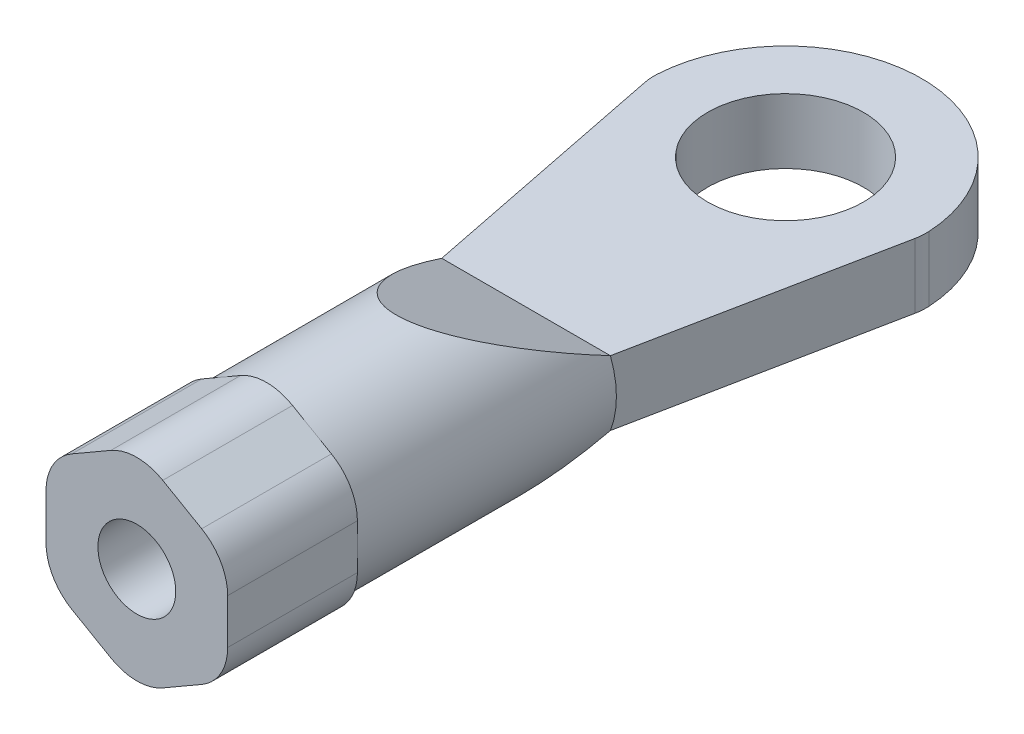
ISO-10303-21;
HEADER;
FILE_DESCRIPTION(('STEP AP214'),'2;1');
FILE_NAME('part.step','',(''),(''),'','','');
FILE_SCHEMA(('AUTOMOTIVE_DESIGN { 1 0 10303 214 1 1 1 1 }'));
ENDSEC;
DATA;
#1=APPLICATION_CONTEXT('core data for automotive mechanical design processes');
#2=APPLICATION_PROTOCOL_DEFINITION('international standard','automotive_design',2000,#1);
#3=PRODUCT_CONTEXT('',#1,'mechanical');
#4=PRODUCT('Part','Part','',(#3));
#5=PRODUCT_RELATED_PRODUCT_CATEGORY('part','',(#4));
#6=PRODUCT_DEFINITION_FORMATION('','',#4);
#7=PRODUCT_DEFINITION_CONTEXT('part definition',#1,'design');
#8=PRODUCT_DEFINITION('design','',#6,#7);
#9=PRODUCT_DEFINITION_SHAPE('','',#8);
#10=(LENGTH_UNIT() NAMED_UNIT(*) SI_UNIT(.MILLI.,.METRE.));
#11=(NAMED_UNIT(*) PLANE_ANGLE_UNIT() SI_UNIT($,.RADIAN.));
#12=(NAMED_UNIT(*) SI_UNIT($,.STERADIAN.) SOLID_ANGLE_UNIT());
#13=UNCERTAINTY_MEASURE_WITH_UNIT(LENGTH_MEASURE(1.E-05),#10,'distance_accuracy_value','');
#14=(GEOMETRIC_REPRESENTATION_CONTEXT(3) GLOBAL_UNCERTAINTY_ASSIGNED_CONTEXT((#13)) GLOBAL_UNIT_ASSIGNED_CONTEXT((#10,
#11,#12)) REPRESENTATION_CONTEXT('',''));
#15=CARTESIAN_POINT('',(0.,0.,0.));
#16=DIRECTION('',(0.,0.,1.));
#17=DIRECTION('',(1.,0.,0.));
#18=AXIS2_PLACEMENT_3D('',#15,#16,#17);
#19=CARTESIAN_POINT('',(0.,1.25,25.));
#20=DIRECTION('',(0.,0.,-1.));
#21=DIRECTION('',(-1.,0.,0.));
#22=AXIS2_PLACEMENT_3D('',#19,#20,#21);
#23=CYLINDRICAL_SURFACE('',#22,3.48209706929603);
#24=CARTESIAN_POINT('',(0.,1.25,7.19994256254673));
#25=DIRECTION('',(0.,0.91314099515027,-0.407643867825795));
#26=DIRECTION('',(0.,-0.407643867825795,-0.91314099515027));
#27=AXIS2_PLACEMENT_3D('',#24,#25,#26);
#28=ELLIPSE('',#27,8.54200772813805,3.48209706929603);
#29=CARTESIAN_POINT('',(-3.25,2.5,10.));
#30=VERTEX_POINT('',#29);
#31=CARTESIAN_POINT('',(3.25,2.5,10.));
#32=VERTEX_POINT('',#31);
#33=EDGE_CURVE('E194',#30,#32,#28,.T.);
#34=ORIENTED_EDGE('',*,*,#33,.F.);
#35=CARTESIAN_POINT('',(0.,1.25,10.));
#36=DIRECTION('',(0.,0.,1.));
#37=DIRECTION('',(1.,0.,0.));
#38=AXIS2_PLACEMENT_3D('',#35,#36,#37);
#39=CIRCLE('',#38,3.48209706929603);
#40=CARTESIAN_POINT('',(-3.25,0.,10.));
#41=VERTEX_POINT('',#40);
#42=EDGE_CURVE('E193',#30,#41,#39,.T.);
#43=ORIENTED_EDGE('',*,*,#42,.T.);
#44=CARTESIAN_POINT('',(0.,1.25,7.19994256254673));
#45=DIRECTION('',(0.,-0.91314099515027,-0.407643867825795));
#46=DIRECTION('',(0.,0.407643867825795,-0.91314099515027));
#47=AXIS2_PLACEMENT_3D('',#44,#45,#46);
#48=ELLIPSE('',#47,8.54200772813805,3.48209706929603);
#49=CARTESIAN_POINT('',(3.25,0.,10.));
#50=VERTEX_POINT('',#49);
#51=EDGE_CURVE('E177',#50,#41,#48,.T.);
#52=ORIENTED_EDGE('',*,*,#51,.F.);
#53=EDGE_CURVE('E191',#50,#32,#39,.T.);
#54=ORIENTED_EDGE('',*,*,#53,.T.);
#55=EDGE_LOOP('',(#34,#43,#52,#54));
#56=FACE_BOUND('',#55,.T.);
#57=CARTESIAN_POINT('',(0.,1.25,20.));
#58=DIRECTION('',(0.,0.,1.));
#59=DIRECTION('',(1.,0.,0.));
#60=AXIS2_PLACEMENT_3D('',#57,#58,#59);
#61=CIRCLE('',#60,3.48209706929603);
#62=CARTESIAN_POINT('',(3.48209706929603,1.25,20.));
#63=VERTEX_POINT('',#62);
#64=EDGE_CURVE('E257',#63,#63,#61,.T.);
#65=ORIENTED_EDGE('',*,*,#64,.F.);
#66=EDGE_LOOP('',(#65));
#67=FACE_BOUND('',#66,.T.);
#68=ADVANCED_FACE('F48',(#56,#67),#23,.T.);
#69=CARTESIAN_POINT('',(5.04807692307692,2.5,1.00961538461538));
#70=DIRECTION('',(0.98058067569092,0.,0.196116135138184));
#71=DIRECTION('',(0.196116135138184,0.,-0.98058067569092));
#72=AXIS2_PLACEMENT_3D('',#69,#70,#71);
#73=PLANE('',#72);
#74=DIRECTION('',(-0.196116135138184,0.,0.98058067569092));
#75=VECTOR('',#74,1.);
#76=CARTESIAN_POINT('',(5.04807692307692,0.,1.00961538461538));
#77=LINE('',#76,#75);
#78=CARTESIAN_POINT('',(5.20646912657525,0.,0.217654367123726));
#79=VERTEX_POINT('',#78);
#80=EDGE_CURVE('E182',#79,#50,#77,.T.);
#81=ORIENTED_EDGE('',*,*,#80,.F.);
#82=DIRECTION('',(0.,1.,0.));
#83=VECTOR('',#82,1.);
#84=CARTESIAN_POINT('',(5.20646912657525,2.5,0.217654367123726));
#85=LINE('',#84,#83);
#86=CARTESIAN_POINT('',(5.20646912657525,2.5,0.217654367123726));
#87=VERTEX_POINT('',#86);
#88=EDGE_CURVE('E255',#79,#87,#85,.T.);
#89=ORIENTED_EDGE('',*,*,#88,.T.);
#90=DIRECTION('',(-0.196116135138184,0.,0.98058067569092));
#91=VECTOR('',#90,1.);
#92=CARTESIAN_POINT('',(5.04807692307692,2.5,1.00961538461538));
#93=LINE('',#92,#91);
#94=EDGE_CURVE('E211',#87,#32,#93,.T.);
#95=ORIENTED_EDGE('',*,*,#94,.T.);
#96=DIRECTION('',(0.,-1.,0.));
#97=VECTOR('',#96,1.);
#98=CARTESIAN_POINT('',(3.25,2.5,10.));
#99=LINE('',#98,#97);
#100=EDGE_CURVE('E208',#32,#50,#99,.T.);
#101=ORIENTED_EDGE('',*,*,#100,.T.);
#102=EDGE_LOOP('',(#81,#89,#95,#101));
#103=FACE_BOUND('',#102,.T.);
#104=ADVANCED_FACE('F209',(#103),#73,.T.);
#105=CARTESIAN_POINT('',(0.,2.5,0.));
#106=DIRECTION('',(0.,-1.,0.));
#107=DIRECTION('',(0.,0.,-1.));
#108=AXIS2_PLACEMENT_3D('',#105,#106,#107);
#109=CYLINDRICAL_SURFACE('',#108,5.25);
#110=CARTESIAN_POINT('',(0.,0.,0.));
#111=DIRECTION('',(0.,1.,0.));
#112=DIRECTION('',(0.,0.,1.));
#113=AXIS2_PLACEMENT_3D('',#110,#111,#112);
#114=CIRCLE('',#113,5.25);
#115=CARTESIAN_POINT('',(5.24242025223552,0.,-0.282010458938883));
#116=VERTEX_POINT('',#115);
#117=CARTESIAN_POINT('',(-5.24242025223552,0.,-0.282010458938881));
#118=VERTEX_POINT('',#117);
#119=EDGE_CURVE('E204',#116,#118,#114,.T.);
#120=ORIENTED_EDGE('',*,*,#119,.T.);
#121=DIRECTION('',(0.,-1.,0.));
#122=VECTOR('',#121,1.);
#123=CARTESIAN_POINT('',(-5.24242025223552,2.5,-0.282010458938881));
#124=LINE('',#123,#122);
#125=CARTESIAN_POINT('',(-5.24242025223552,2.5,-0.282010458938881));
#126=VERTEX_POINT('',#125);
#127=EDGE_CURVE('E249',#118,#126,#124,.F.);
#128=ORIENTED_EDGE('',*,*,#127,.T.);
#129=CARTESIAN_POINT('',(0.,2.5,0.));
#130=DIRECTION('',(0.,1.,0.));
#131=DIRECTION('',(0.,0.,1.));
#132=AXIS2_PLACEMENT_3D('',#129,#130,#131);
#133=CIRCLE('',#132,5.25);
#134=CARTESIAN_POINT('',(5.24242025223552,2.5,-0.282010458938883));
#135=VERTEX_POINT('',#134);
#136=EDGE_CURVE('E230',#135,#126,#133,.T.);
#137=ORIENTED_EDGE('',*,*,#136,.F.);
#138=DIRECTION('',(0.,-1.,0.));
#139=VECTOR('',#138,1.);
#140=CARTESIAN_POINT('',(5.24242025223552,2.5,-0.282010458938883));
#141=LINE('',#140,#139);
#142=EDGE_CURVE('E246',#135,#116,#141,.T.);
#143=ORIENTED_EDGE('',*,*,#142,.T.);
#144=EDGE_LOOP('',(#120,#128,#137,#143));
#145=FACE_BOUND('',#144,.T.);
#146=ADVANCED_FACE('F404',(#145),#109,.T.);
#147=CARTESIAN_POINT('',(-5.04807692307692,2.5,1.00961538461539));
#148=DIRECTION('',(0.98058067569092,0.,-0.196116135138184));
#149=DIRECTION('',(-0.196116135138184,0.,-0.98058067569092));
#150=AXIS2_PLACEMENT_3D('',#147,#148,#149);
#151=PLANE('',#150);
#152=DIRECTION('',(0.196116135138184,0.,0.98058067569092));
#153=VECTOR('',#152,1.);
#154=CARTESIAN_POINT('',(-5.04807692307692,2.5,1.00961538461539));
#155=LINE('',#154,#153);
#156=CARTESIAN_POINT('',(-5.20646912657525,2.5,0.217654367123727));
#157=VERTEX_POINT('',#156);
#158=EDGE_CURVE('E233',#157,#30,#155,.T.);
#159=ORIENTED_EDGE('',*,*,#158,.F.);
#160=DIRECTION('',(0.,-1.,0.));
#161=VECTOR('',#160,1.);
#162=CARTESIAN_POINT('',(-5.20646912657525,2.5,0.217654367123728));
#163=LINE('',#162,#161);
#164=CARTESIAN_POINT('',(-5.20646912657525,0.,0.217654367123727));
#165=VERTEX_POINT('',#164);
#166=EDGE_CURVE('E214',#157,#165,#163,.T.);
#167=ORIENTED_EDGE('',*,*,#166,.T.);
#168=DIRECTION('',(0.196116135138184,0.,0.98058067569092));
#169=VECTOR('',#168,1.);
#170=CARTESIAN_POINT('',(-5.04807692307692,0.,1.00961538461539));
#171=LINE('',#170,#169);
#172=EDGE_CURVE('E228',#165,#41,#171,.T.);
#173=ORIENTED_EDGE('',*,*,#172,.T.);
#174=DIRECTION('',(0.,-1.,0.));
#175=VECTOR('',#174,1.);
#176=CARTESIAN_POINT('',(-3.25,2.5,10.));
#177=LINE('',#176,#175);
#178=EDGE_CURVE('E215',#30,#41,#177,.T.);
#179=ORIENTED_EDGE('',*,*,#178,.F.);
#180=EDGE_LOOP('',(#159,#167,#173,#179));
#181=FACE_BOUND('',#180,.T.);
#182=ADVANCED_FACE('F416',(#181),#151,.F.);
#183=CARTESIAN_POINT('',(0.,2.5,0.));
#184=DIRECTION('',(0.,1.,0.));
#185=DIRECTION('',(0.,0.,1.));
#186=AXIS2_PLACEMENT_3D('',#183,#184,#185);
#187=PLANE('',#186);
#188=CARTESIAN_POINT('',(0.,2.5,0.));
#189=DIRECTION('',(0.,1.,0.));
#190=DIRECTION('',(0.,0.,1.));
#191=AXIS2_PLACEMENT_3D('',#188,#189,#190);
#192=CIRCLE('',#191,3.);
#193=CARTESIAN_POINT('',(0.,2.5,3.));
#194=VERTEX_POINT('',#193);
#195=EDGE_CURVE('E219',#194,#194,#192,.T.);
#196=ORIENTED_EDGE('',*,*,#195,.F.);
#197=EDGE_LOOP('',(#196));
#198=FACE_BOUND('',#197,.T.);
#199=ORIENTED_EDGE('',*,*,#136,.T.);
#200=CARTESIAN_POINT('',(-3.24530777519341,2.5,-0.174577903152641));
#201=DIRECTION('',(0.,1.,0.));
#202=DIRECTION('',(0.,0.,1.));
#203=AXIS2_PLACEMENT_3D('',#200,#201,#202);
#204=CIRCLE('',#203,2.);
#205=EDGE_CURVE('E253',#126,#157,#204,.T.);
#206=ORIENTED_EDGE('',*,*,#205,.T.);
#207=ORIENTED_EDGE('',*,*,#158,.T.);
#208=DIRECTION('',(1.,0.,0.));
#209=VECTOR('',#208,1.);
#210=CARTESIAN_POINT('',(0.,2.5,10.));
#211=LINE('',#210,#209);
#212=EDGE_CURVE('E226',#30,#32,#211,.T.);
#213=ORIENTED_EDGE('',*,*,#212,.T.);
#214=ORIENTED_EDGE('',*,*,#94,.F.);
#215=CARTESIAN_POINT('',(3.24530777519341,2.5,-0.174577903152642));
#216=DIRECTION('',(0.,1.,0.));
#217=DIRECTION('',(0.,0.,1.));
#218=AXIS2_PLACEMENT_3D('',#215,#216,#217);
#219=CIRCLE('',#218,2.);
#220=EDGE_CURVE('E251',#87,#135,#219,.T.);
#221=ORIENTED_EDGE('',*,*,#220,.T.);
#222=EDGE_LOOP('',(#199,#206,#207,#213,#214,#221));
#223=FACE_BOUND('',#222,.T.);
#224=ADVANCED_FACE('F413',(#198,#223),#187,.T.);
#225=CARTESIAN_POINT('',(0.,0.,0.));
#226=DIRECTION('',(0.,1.,0.));
#227=DIRECTION('',(0.,0.,1.));
#228=AXIS2_PLACEMENT_3D('',#225,#226,#227);
#229=PLANE('',#228);
#230=CARTESIAN_POINT('',(0.,0.,0.));
#231=DIRECTION('',(0.,1.,0.));
#232=DIRECTION('',(0.,0.,1.));
#233=AXIS2_PLACEMENT_3D('',#230,#231,#232);
#234=CIRCLE('',#233,3.);
#235=CARTESIAN_POINT('',(0.,0.,3.));
#236=VERTEX_POINT('',#235);
#237=EDGE_CURVE('E183',#236,#236,#234,.T.);
#238=ORIENTED_EDGE('',*,*,#237,.T.);
#239=EDGE_LOOP('',(#238));
#240=FACE_BOUND('',#239,.T.);
#241=ORIENTED_EDGE('',*,*,#172,.F.);
#242=CARTESIAN_POINT('',(-3.24530777519341,0.,-0.174577903152641));
#243=DIRECTION('',(0.,1.,0.));
#244=DIRECTION('',(0.,0.,1.));
#245=AXIS2_PLACEMENT_3D('',#242,#243,#244);
#246=CIRCLE('',#245,2.);
#247=EDGE_CURVE('E244',#165,#118,#246,.F.);
#248=ORIENTED_EDGE('',*,*,#247,.T.);
#249=ORIENTED_EDGE('',*,*,#119,.F.);
#250=CARTESIAN_POINT('',(3.24530777519341,0.,-0.174577903152642));
#251=DIRECTION('',(0.,1.,0.));
#252=DIRECTION('',(0.,0.,1.));
#253=AXIS2_PLACEMENT_3D('',#250,#251,#252);
#254=CIRCLE('',#253,2.);
#255=EDGE_CURVE('E201',#116,#79,#254,.F.);
#256=ORIENTED_EDGE('',*,*,#255,.T.);
#257=ORIENTED_EDGE('',*,*,#80,.T.);
#258=DIRECTION('',(1.,0.,0.));
#259=VECTOR('',#258,1.);
#260=CARTESIAN_POINT('',(0.,0.,10.));
#261=LINE('',#260,#259);
#262=EDGE_CURVE('E174',#41,#50,#261,.T.);
#263=ORIENTED_EDGE('',*,*,#262,.F.);
#264=EDGE_LOOP('',(#241,#248,#249,#256,#257,#263));
#265=FACE_BOUND('',#264,.T.);
#266=ADVANCED_FACE('F199',(#240,#265),#229,.F.);
#267=CARTESIAN_POINT('',(0.,0.,0.));
#268=DIRECTION('',(0.,1.,0.));
#269=DIRECTION('',(0.,0.,1.));
#270=AXIS2_PLACEMENT_3D('',#267,#268,#269);
#271=CYLINDRICAL_SURFACE('',#270,3.);
#272=ORIENTED_EDGE('',*,*,#237,.F.);
#273=EDGE_LOOP('',(#272));
#274=FACE_BOUND('',#273,.T.);
#275=ORIENTED_EDGE('',*,*,#195,.T.);
#276=EDGE_LOOP('',(#275));
#277=FACE_BOUND('',#276,.T.);
#278=ADVANCED_FACE('F408',(#274,#277),#271,.F.);
#279=CARTESIAN_POINT('',(-3.24530777519341,2.5,-0.174577903152641));
#280=DIRECTION('',(0.,-1.,0.));
#281=DIRECTION('',(0.,0.,-1.));
#282=AXIS2_PLACEMENT_3D('',#279,#280,#281);
#283=CYLINDRICAL_SURFACE('',#282,2.);
#284=ORIENTED_EDGE('',*,*,#205,.F.);
#285=ORIENTED_EDGE('',*,*,#127,.F.);
#286=ORIENTED_EDGE('',*,*,#247,.F.);
#287=ORIENTED_EDGE('',*,*,#166,.F.);
#288=EDGE_LOOP('',(#284,#285,#286,#287));
#289=FACE_BOUND('',#288,.T.);
#290=ADVANCED_FACE('F411',(#289),#283,.T.);
#291=CARTESIAN_POINT('',(3.24530777519341,2.5,-0.174577903152642));
#292=DIRECTION('',(0.,-1.,0.));
#293=DIRECTION('',(0.,0.,-1.));
#294=AXIS2_PLACEMENT_3D('',#291,#292,#293);
#295=CYLINDRICAL_SURFACE('',#294,2.);
#296=ORIENTED_EDGE('',*,*,#220,.F.);
#297=ORIENTED_EDGE('',*,*,#88,.F.);
#298=ORIENTED_EDGE('',*,*,#255,.F.);
#299=ORIENTED_EDGE('',*,*,#142,.F.);
#300=EDGE_LOOP('',(#296,#297,#298,#299));
#301=FACE_BOUND('',#300,.T.);
#302=ADVANCED_FACE('F429',(#301),#295,.T.);
#303=CARTESIAN_POINT('',(0.,1.25,10.));
#304=DIRECTION('',(0.,0.,1.));
#305=DIRECTION('',(1.,0.,0.));
#306=AXIS2_PLACEMENT_3D('',#303,#304,#305);
#307=PLANE('',#306);
#308=ORIENTED_EDGE('',*,*,#100,.F.);
#309=ORIENTED_EDGE('',*,*,#53,.F.);
#310=EDGE_LOOP('',(#308,#309));
#311=FACE_BOUND('',#310,.T.);
#312=ADVANCED_FACE('F217',(#311),#307,.F.);
#313=ORIENTED_EDGE('',*,*,#42,.F.);
#314=ORIENTED_EDGE('',*,*,#178,.T.);
#315=EDGE_LOOP('',(#313,#314));
#316=FACE_BOUND('',#315,.T.);
#317=ADVANCED_FACE('F407',(#316),#307,.F.);
#318=CARTESIAN_POINT('',(15.,0.,10.));
#319=DIRECTION('',(0.,-0.91314099515027,-0.407643867825795));
#320=DIRECTION('',(0.,0.407643867825795,-0.91314099515027));
#321=AXIS2_PLACEMENT_3D('',#318,#319,#320);
#322=PLANE('',#321);
#323=ORIENTED_EDGE('',*,*,#51,.T.);
#324=ORIENTED_EDGE('',*,*,#262,.T.);
#325=EDGE_LOOP('',(#323,#324));
#326=FACE_BOUND('',#325,.T.);
#327=ADVANCED_FACE('F176',(#326),#322,.T.);
#328=CARTESIAN_POINT('',(15.,2.5,10.));
#329=DIRECTION('',(0.,0.91314099515027,-0.407643867825795));
#330=DIRECTION('',(0.,0.407643867825795,0.91314099515027));
#331=AXIS2_PLACEMENT_3D('',#328,#329,#330);
#332=PLANE('',#331);
#333=ORIENTED_EDGE('',*,*,#33,.T.);
#334=ORIENTED_EDGE('',*,*,#212,.F.);
#335=EDGE_LOOP('',(#333,#334));
#336=FACE_BOUND('',#335,.T.);
#337=ADVANCED_FACE('F560',(#336),#332,.T.);
#338=CARTESIAN_POINT('',(0.,0.,20.));
#339=DIRECTION('',(0.,0.,1.));
#340=DIRECTION('',(1.,0.,0.));
#341=AXIS2_PLACEMENT_3D('',#338,#339,#340);
#342=PLANE('',#341);
#343=DIRECTION('',(0.866025403784439,0.5,0.));
#344=VECTOR('',#343,1.);
#345=CARTESIAN_POINT('',(0.,-2.79145188432738,20.));
#346=LINE('',#345,#344);
#347=CARTESIAN_POINT('',(1.,-2.21410161513776,20.));
#348=VERTEX_POINT('',#347);
#349=CARTESIAN_POINT('',(2.5,-1.34807621135332,20.));
#350=VERTEX_POINT('',#349);
#351=EDGE_CURVE('E347',#348,#350,#346,.T.);
#352=ORIENTED_EDGE('',*,*,#351,.F.);
#353=CARTESIAN_POINT('',(0.,-0.482050807568878,20.));
#354=DIRECTION('',(0.,0.,1.));
#355=DIRECTION('',(1.,0.,0.));
#356=AXIS2_PLACEMENT_3D('',#353,#354,#355);
#357=CIRCLE('',#356,2.);
#358=CARTESIAN_POINT('',(-0.999999999999999,-2.21410161513776,20.));
#359=VERTEX_POINT('',#358);
#360=EDGE_CURVE('E289',#348,#359,#357,.F.);
#361=ORIENTED_EDGE('',*,*,#360,.T.);
#362=DIRECTION('',(0.866025403784439,-0.5,0.));
#363=VECTOR('',#362,1.);
#364=CARTESIAN_POINT('',(-3.5,-0.77072594216369,20.));
#365=LINE('',#364,#363);
#366=CARTESIAN_POINT('',(-2.5,-1.34807621135332,20.));
#367=VERTEX_POINT('',#366);
#368=EDGE_CURVE('E350',#367,#359,#365,.T.);
#369=ORIENTED_EDGE('',*,*,#368,.F.);
#370=CARTESIAN_POINT('',(-1.5,0.383974596215561,20.));
#371=DIRECTION('',(0.,0.,1.));
#372=DIRECTION('',(1.,0.,0.));
#373=AXIS2_PLACEMENT_3D('',#370,#371,#372);
#374=CIRCLE('',#373,2.);
#375=CARTESIAN_POINT('',(-3.5,0.383974596215561,20.));
#376=VERTEX_POINT('',#375);
#377=EDGE_CURVE('E285',#367,#376,#374,.F.);
#378=ORIENTED_EDGE('',*,*,#377,.T.);
#379=DIRECTION('',(0.,-1.,0.));
#380=VECTOR('',#379,1.);
#381=CARTESIAN_POINT('',(-3.5,3.27072594216369,20.));
#382=LINE('',#381,#380);
#383=CARTESIAN_POINT('',(-3.5,2.11602540378444,20.));
#384=VERTEX_POINT('',#383);
#385=EDGE_CURVE('E374',#384,#376,#382,.T.);
#386=ORIENTED_EDGE('',*,*,#385,.F.);
#387=CARTESIAN_POINT('',(-1.5,2.11602540378444,20.));
#388=DIRECTION('',(0.,0.,1.));
#389=DIRECTION('',(1.,0.,0.));
#390=AXIS2_PLACEMENT_3D('',#387,#388,#389);
#391=CIRCLE('',#390,2.);
#392=CARTESIAN_POINT('',(-2.5,3.84807621135332,20.));
#393=VERTEX_POINT('',#392);
#394=EDGE_CURVE('E63',#384,#393,#391,.F.);
#395=ORIENTED_EDGE('',*,*,#394,.T.);
#396=DIRECTION('',(-0.866025403784439,-0.5,0.));
#397=VECTOR('',#396,1.);
#398=CARTESIAN_POINT('',(0.,5.29145188432738,20.));
#399=LINE('',#398,#397);
#400=CARTESIAN_POINT('',(-0.999999999999999,4.71410161513776,20.));
#401=VERTEX_POINT('',#400);
#402=EDGE_CURVE('E322',#401,#393,#399,.T.);
#403=ORIENTED_EDGE('',*,*,#402,.F.);
#404=CARTESIAN_POINT('',(0.,2.98205080756888,20.));
#405=DIRECTION('',(0.,0.,1.));
#406=DIRECTION('',(1.,0.,0.));
#407=AXIS2_PLACEMENT_3D('',#404,#405,#406);
#408=CIRCLE('',#407,2.);
#409=CARTESIAN_POINT('',(1.,4.71410161513776,20.));
#410=VERTEX_POINT('',#409);
#411=EDGE_CURVE('E282',#401,#410,#408,.F.);
#412=ORIENTED_EDGE('',*,*,#411,.T.);
#413=DIRECTION('',(-0.866025403784438,0.5,0.));
#414=VECTOR('',#413,1.);
#415=CARTESIAN_POINT('',(3.5,3.27072594216369,20.));
#416=LINE('',#415,#414);
#417=CARTESIAN_POINT('',(2.5,3.84807621135332,20.));
#418=VERTEX_POINT('',#417);
#419=EDGE_CURVE('E310',#418,#410,#416,.T.);
#420=ORIENTED_EDGE('',*,*,#419,.F.);
#421=CARTESIAN_POINT('',(1.5,2.11602540378444,20.));
#422=DIRECTION('',(0.,0.,1.));
#423=DIRECTION('',(1.,0.,0.));
#424=AXIS2_PLACEMENT_3D('',#421,#422,#423);
#425=CIRCLE('',#424,2.);
#426=CARTESIAN_POINT('',(3.5,2.11602540378444,20.));
#427=VERTEX_POINT('',#426);
#428=EDGE_CURVE('E280',#418,#427,#425,.F.);
#429=ORIENTED_EDGE('',*,*,#428,.T.);
#430=DIRECTION('',(0.,1.,0.));
#431=VECTOR('',#430,1.);
#432=CARTESIAN_POINT('',(3.5,-0.770725942163692,20.));
#433=LINE('',#432,#431);
#434=CARTESIAN_POINT('',(3.5,0.38397459621556,20.));
#435=VERTEX_POINT('',#434);
#436=EDGE_CURVE('E331',#435,#427,#433,.T.);
#437=ORIENTED_EDGE('',*,*,#436,.F.);
#438=CARTESIAN_POINT('',(1.5,0.38397459621556,20.));
#439=DIRECTION('',(0.,0.,1.));
#440=DIRECTION('',(1.,0.,0.));
#441=AXIS2_PLACEMENT_3D('',#438,#439,#440);
#442=CIRCLE('',#441,2.);
#443=EDGE_CURVE('E287',#435,#350,#442,.F.);
#444=ORIENTED_EDGE('',*,*,#443,.T.);
#445=EDGE_LOOP('',(#352,#361,#369,#378,#386,#395,#403,#412,#420,#429,#437,#444));
#446=FACE_BOUND('',#445,.T.);
#447=ORIENTED_EDGE('',*,*,#64,.T.);
#448=EDGE_LOOP('',(#447));
#449=FACE_BOUND('',#448,.T.);
#450=ADVANCED_FACE('F317',(#446,#449),#342,.F.);
#451=CARTESIAN_POINT('',(3.5,3.27072594216369,20.));
#452=DIRECTION('',(0.5,0.866025403784439,0.));
#453=DIRECTION('',(-0.866025403784439,0.5,0.));
#454=AXIS2_PLACEMENT_3D('',#451,#452,#453);
#455=PLANE('',#454);
#456=ORIENTED_EDGE('',*,*,#419,.T.);
#457=DIRECTION('',(0.,0.,1.));
#458=VECTOR('',#457,1.);
#459=CARTESIAN_POINT('',(1.,4.71410161513776,20.));
#460=LINE('',#459,#458);
#461=CARTESIAN_POINT('',(1.,4.71410161513776,25.));
#462=VERTEX_POINT('',#461);
#463=EDGE_CURVE('E11',#410,#462,#460,.T.);
#464=ORIENTED_EDGE('',*,*,#463,.T.);
#465=DIRECTION('',(-0.866025403784438,0.5,0.));
#466=VECTOR('',#465,1.);
#467=CARTESIAN_POINT('',(3.5,3.27072594216369,25.));
#468=LINE('',#467,#466);
#469=CARTESIAN_POINT('',(2.5,3.84807621135332,25.));
#470=VERTEX_POINT('',#469);
#471=EDGE_CURVE('E313',#470,#462,#468,.T.);
#472=ORIENTED_EDGE('',*,*,#471,.F.);
#473=DIRECTION('',(0.,0.,1.));
#474=VECTOR('',#473,1.);
#475=CARTESIAN_POINT('',(2.5,3.84807621135332,20.));
#476=LINE('',#475,#474);
#477=EDGE_CURVE('E56',#470,#418,#476,.F.);
#478=ORIENTED_EDGE('',*,*,#477,.T.);
#479=EDGE_LOOP('',(#456,#464,#472,#478));
#480=FACE_BOUND('',#479,.T.);
#481=ADVANCED_FACE('F309',(#480),#455,.T.);
#482=CARTESIAN_POINT('',(3.5,-0.770725942163692,20.));
#483=DIRECTION('',(1.,0.,0.));
#484=DIRECTION('',(0.,0.,-1.));
#485=AXIS2_PLACEMENT_3D('',#482,#483,#484);
#486=PLANE('',#485);
#487=DIRECTION('',(0.,1.,0.));
#488=VECTOR('',#487,1.);
#489=CARTESIAN_POINT('',(3.5,-0.770725942163692,25.));
#490=LINE('',#489,#488);
#491=CARTESIAN_POINT('',(3.5,0.38397459621556,25.));
#492=VERTEX_POINT('',#491);
#493=CARTESIAN_POINT('',(3.5,2.11602540378444,25.));
#494=VERTEX_POINT('',#493);
#495=EDGE_CURVE('E323',#492,#494,#490,.T.);
#496=ORIENTED_EDGE('',*,*,#495,.F.);
#497=DIRECTION('',(0.,0.,1.));
#498=VECTOR('',#497,1.);
#499=CARTESIAN_POINT('',(3.5,0.38397459621556,20.));
#500=LINE('',#499,#498);
#501=EDGE_CURVE('E294',#492,#435,#500,.F.);
#502=ORIENTED_EDGE('',*,*,#501,.T.);
#503=ORIENTED_EDGE('',*,*,#436,.T.);
#504=DIRECTION('',(0.,0.,1.));
#505=VECTOR('',#504,1.);
#506=CARTESIAN_POINT('',(3.5,2.11602540378444,20.));
#507=LINE('',#506,#505);
#508=EDGE_CURVE('E291',#427,#494,#507,.T.);
#509=ORIENTED_EDGE('',*,*,#508,.T.);
#510=EDGE_LOOP('',(#496,#502,#503,#509));
#511=FACE_BOUND('',#510,.T.);
#512=ADVANCED_FACE('F329',(#511),#486,.T.);
#513=CARTESIAN_POINT('',(0.,-2.79145188432738,20.));
#514=DIRECTION('',(0.5,-0.866025403784439,0.));
#515=DIRECTION('',(0.866025403784439,0.5,0.));
#516=AXIS2_PLACEMENT_3D('',#513,#514,#515);
#517=PLANE('',#516);
#518=DIRECTION('',(0.866025403784439,0.5,0.));
#519=VECTOR('',#518,1.);
#520=CARTESIAN_POINT('',(0.,-2.79145188432738,25.));
#521=LINE('',#520,#519);
#522=CARTESIAN_POINT('',(1.,-2.21410161513776,25.));
#523=VERTEX_POINT('',#522);
#524=CARTESIAN_POINT('',(2.5,-1.34807621135332,25.));
#525=VERTEX_POINT('',#524);
#526=EDGE_CURVE('E336',#523,#525,#521,.T.);
#527=ORIENTED_EDGE('',*,*,#526,.F.);
#528=DIRECTION('',(0.,0.,1.));
#529=VECTOR('',#528,1.);
#530=CARTESIAN_POINT('',(1.,-2.21410161513776,20.));
#531=LINE('',#530,#529);
#532=EDGE_CURVE('E278',#523,#348,#531,.F.);
#533=ORIENTED_EDGE('',*,*,#532,.T.);
#534=ORIENTED_EDGE('',*,*,#351,.T.);
#535=DIRECTION('',(0.,0.,1.));
#536=VECTOR('',#535,1.);
#537=CARTESIAN_POINT('',(2.5,-1.34807621135332,20.));
#538=LINE('',#537,#536);
#539=EDGE_CURVE('E275',#350,#525,#538,.T.);
#540=ORIENTED_EDGE('',*,*,#539,.T.);
#541=EDGE_LOOP('',(#527,#533,#534,#540));
#542=FACE_BOUND('',#541,.T.);
#543=ADVANCED_FACE('F522',(#542),#517,.T.);
#544=CARTESIAN_POINT('',(-3.5,-0.77072594216369,20.));
#545=DIRECTION('',(-0.5,-0.866025403784439,0.));
#546=DIRECTION('',(0.866025403784439,-0.5,0.));
#547=AXIS2_PLACEMENT_3D('',#544,#545,#546);
#548=PLANE('',#547);
#549=ORIENTED_EDGE('',*,*,#368,.T.);
#550=DIRECTION('',(0.,0.,1.));
#551=VECTOR('',#550,1.);
#552=CARTESIAN_POINT('',(-0.999999999999999,-2.21410161513776,20.));
#553=LINE('',#552,#551);
#554=CARTESIAN_POINT('',(-0.999999999999999,-2.21410161513776,25.));
#555=VERTEX_POINT('',#554);
#556=EDGE_CURVE('E260',#359,#555,#553,.T.);
#557=ORIENTED_EDGE('',*,*,#556,.T.);
#558=DIRECTION('',(0.866025403784439,-0.5,0.));
#559=VECTOR('',#558,1.);
#560=CARTESIAN_POINT('',(-3.5,-0.77072594216369,25.));
#561=LINE('',#560,#559);
#562=CARTESIAN_POINT('',(-2.5,-1.34807621135332,25.));
#563=VERTEX_POINT('',#562);
#564=EDGE_CURVE('E338',#563,#555,#561,.T.);
#565=ORIENTED_EDGE('',*,*,#564,.F.);
#566=DIRECTION('',(0.,0.,1.));
#567=VECTOR('',#566,1.);
#568=CARTESIAN_POINT('',(-2.5,-1.34807621135332,20.));
#569=LINE('',#568,#567);
#570=EDGE_CURVE('E258',#563,#367,#569,.F.);
#571=ORIENTED_EDGE('',*,*,#570,.T.);
#572=EDGE_LOOP('',(#549,#557,#565,#571));
#573=FACE_BOUND('',#572,.T.);
#574=ADVANCED_FACE('F366',(#573),#548,.T.);
#575=CARTESIAN_POINT('',(-3.5,3.27072594216369,20.));
#576=DIRECTION('',(-1.,0.,0.));
#577=DIRECTION('',(0.,0.,1.));
#578=AXIS2_PLACEMENT_3D('',#575,#576,#577);
#579=PLANE('',#578);
#580=ORIENTED_EDGE('',*,*,#385,.T.);
#581=DIRECTION('',(0.,0.,1.));
#582=VECTOR('',#581,1.);
#583=CARTESIAN_POINT('',(-3.5,0.383974596215561,20.));
#584=LINE('',#583,#582);
#585=CARTESIAN_POINT('',(-3.5,0.383974596215561,25.));
#586=VERTEX_POINT('',#585);
#587=EDGE_CURVE('E298',#376,#586,#584,.T.);
#588=ORIENTED_EDGE('',*,*,#587,.T.);
#589=DIRECTION('',(0.,-1.,0.));
#590=VECTOR('',#589,1.);
#591=CARTESIAN_POINT('',(-3.5,3.27072594216369,25.));
#592=LINE('',#591,#590);
#593=CARTESIAN_POINT('',(-3.5,2.11602540378444,25.));
#594=VERTEX_POINT('',#593);
#595=EDGE_CURVE('E359',#594,#586,#592,.T.);
#596=ORIENTED_EDGE('',*,*,#595,.F.);
#597=DIRECTION('',(0.,0.,1.));
#598=VECTOR('',#597,1.);
#599=CARTESIAN_POINT('',(-3.5,2.11602540378444,20.));
#600=LINE('',#599,#598);
#601=EDGE_CURVE('E296',#594,#384,#600,.F.);
#602=ORIENTED_EDGE('',*,*,#601,.T.);
#603=EDGE_LOOP('',(#580,#588,#596,#602));
#604=FACE_BOUND('',#603,.T.);
#605=ADVANCED_FACE('F376',(#604),#579,.T.);
#606=CARTESIAN_POINT('',(0.,5.29145188432738,20.));
#607=DIRECTION('',(-0.5,0.866025403784439,0.));
#608=DIRECTION('',(-0.866025403784439,-0.5,0.));
#609=AXIS2_PLACEMENT_3D('',#606,#607,#608);
#610=PLANE('',#609);
#611=ORIENTED_EDGE('',*,*,#402,.T.);
#612=DIRECTION('',(0.,0.,1.));
#613=VECTOR('',#612,1.);
#614=CARTESIAN_POINT('',(-2.5,3.84807621135332,20.));
#615=LINE('',#614,#613);
#616=CARTESIAN_POINT('',(-2.5,3.84807621135332,25.));
#617=VERTEX_POINT('',#616);
#618=EDGE_CURVE('E302',#393,#617,#615,.T.);
#619=ORIENTED_EDGE('',*,*,#618,.T.);
#620=DIRECTION('',(-0.866025403784439,-0.5,0.));
#621=VECTOR('',#620,1.);
#622=CARTESIAN_POINT('',(0.,5.29145188432738,25.));
#623=LINE('',#622,#621);
#624=CARTESIAN_POINT('',(-0.999999999999999,4.71410161513776,25.));
#625=VERTEX_POINT('',#624);
#626=EDGE_CURVE('E355',#625,#617,#623,.T.);
#627=ORIENTED_EDGE('',*,*,#626,.F.);
#628=DIRECTION('',(0.,0.,1.));
#629=VECTOR('',#628,1.);
#630=CARTESIAN_POINT('',(-0.999999999999999,4.71410161513776,20.));
#631=LINE('',#630,#629);
#632=EDGE_CURVE('E70',#625,#401,#631,.F.);
#633=ORIENTED_EDGE('',*,*,#632,.T.);
#634=EDGE_LOOP('',(#611,#619,#627,#633));
#635=FACE_BOUND('',#634,.T.);
#636=ADVANCED_FACE('F389',(#635),#610,.T.);
#637=CARTESIAN_POINT('',(0.,1.25,25.));
#638=DIRECTION('',(0.,0.,1.));
#639=DIRECTION('',(1.,0.,0.));
#640=AXIS2_PLACEMENT_3D('',#637,#638,#639);
#641=PLANE('',#640);
#642=CARTESIAN_POINT('',(0.,1.25,25.));
#643=DIRECTION('',(0.,0.,1.));
#644=DIRECTION('',(1.,0.,0.));
#645=AXIS2_PLACEMENT_3D('',#642,#643,#644);
#646=CIRCLE('',#645,1.5);
#647=CARTESIAN_POINT('',(1.5,1.25,25.));
#648=VERTEX_POINT('',#647);
#649=EDGE_CURVE('E356',#648,#648,#646,.T.);
#650=ORIENTED_EDGE('',*,*,#649,.F.);
#651=EDGE_LOOP('',(#650));
#652=FACE_BOUND('',#651,.T.);
#653=ORIENTED_EDGE('',*,*,#564,.T.);
#654=CARTESIAN_POINT('',(0.,-0.482050807568878,25.));
#655=DIRECTION('',(0.,0.,1.));
#656=DIRECTION('',(1.,0.,0.));
#657=AXIS2_PLACEMENT_3D('',#654,#655,#656);
#658=CIRCLE('',#657,2.);
#659=EDGE_CURVE('E273',#555,#523,#658,.T.);
#660=ORIENTED_EDGE('',*,*,#659,.T.);
#661=ORIENTED_EDGE('',*,*,#526,.T.);
#662=CARTESIAN_POINT('',(1.5,0.38397459621556,25.));
#663=DIRECTION('',(0.,0.,1.));
#664=DIRECTION('',(1.,0.,0.));
#665=AXIS2_PLACEMENT_3D('',#662,#663,#664);
#666=CIRCLE('',#665,2.);
#667=EDGE_CURVE('E271',#525,#492,#666,.T.);
#668=ORIENTED_EDGE('',*,*,#667,.T.);
#669=ORIENTED_EDGE('',*,*,#495,.T.);
#670=CARTESIAN_POINT('',(1.5,2.11602540378444,25.));
#671=DIRECTION('',(0.,0.,1.));
#672=DIRECTION('',(1.,0.,0.));
#673=AXIS2_PLACEMENT_3D('',#670,#671,#672);
#674=CIRCLE('',#673,2.);
#675=EDGE_CURVE('E263',#494,#470,#674,.T.);
#676=ORIENTED_EDGE('',*,*,#675,.T.);
#677=ORIENTED_EDGE('',*,*,#471,.T.);
#678=CARTESIAN_POINT('',(0.,2.98205080756888,25.));
#679=DIRECTION('',(0.,0.,1.));
#680=DIRECTION('',(1.,0.,0.));
#681=AXIS2_PLACEMENT_3D('',#678,#679,#680);
#682=CIRCLE('',#681,2.);
#683=EDGE_CURVE('E265',#462,#625,#682,.T.);
#684=ORIENTED_EDGE('',*,*,#683,.T.);
#685=ORIENTED_EDGE('',*,*,#626,.T.);
#686=CARTESIAN_POINT('',(-1.5,2.11602540378444,25.));
#687=DIRECTION('',(0.,0.,1.));
#688=DIRECTION('',(1.,0.,0.));
#689=AXIS2_PLACEMENT_3D('',#686,#687,#688);
#690=CIRCLE('',#689,2.);
#691=EDGE_CURVE('E267',#617,#594,#690,.T.);
#692=ORIENTED_EDGE('',*,*,#691,.T.);
#693=ORIENTED_EDGE('',*,*,#595,.T.);
#694=CARTESIAN_POINT('',(-1.5,0.383974596215561,25.));
#695=DIRECTION('',(0.,0.,1.));
#696=DIRECTION('',(1.,0.,0.));
#697=AXIS2_PLACEMENT_3D('',#694,#695,#696);
#698=CIRCLE('',#697,2.);
#699=EDGE_CURVE('E269',#586,#563,#698,.T.);
#700=ORIENTED_EDGE('',*,*,#699,.T.);
#701=EDGE_LOOP('',(#653,#660,#661,#668,#669,#676,#677,#684,#685,#692,#693,#700));
#702=FACE_BOUND('',#701,.T.);
#703=ADVANCED_FACE('F334',(#652,#702),#641,.T.);
#704=CARTESIAN_POINT('',(0.,1.25,15.));
#705=DIRECTION('',(0.,0.,1.));
#706=DIRECTION('',(1.,0.,0.));
#707=AXIS2_PLACEMENT_3D('',#704,#705,#706);
#708=PLANE('',#707);
#709=CARTESIAN_POINT('',(0.,1.25,15.));
#710=DIRECTION('',(0.,0.,1.));
#711=DIRECTION('',(1.,0.,0.));
#712=AXIS2_PLACEMENT_3D('',#709,#710,#711);
#713=CIRCLE('',#712,1.5);
#714=CARTESIAN_POINT('',(1.5,1.25,15.));
#715=VERTEX_POINT('',#714);
#716=EDGE_CURVE('E195',#715,#715,#713,.T.);
#717=ORIENTED_EDGE('',*,*,#716,.T.);
#718=EDGE_LOOP('',(#717));
#719=FACE_BOUND('',#718,.T.);
#720=ADVANCED_FACE('F388',(#719),#708,.T.);
#721=CARTESIAN_POINT('',(0.,1.25,15.));
#722=DIRECTION('',(0.,0.,1.));
#723=DIRECTION('',(1.,0.,0.));
#724=AXIS2_PLACEMENT_3D('',#721,#722,#723);
#725=CYLINDRICAL_SURFACE('',#724,1.5);
#726=ORIENTED_EDGE('',*,*,#716,.F.);
#727=EDGE_LOOP('',(#726));
#728=FACE_BOUND('',#727,.T.);
#729=ORIENTED_EDGE('',*,*,#649,.T.);
#730=EDGE_LOOP('',(#729));
#731=FACE_BOUND('',#730,.T.);
#732=ADVANCED_FACE('F385',(#728,#731),#725,.F.);
#733=CARTESIAN_POINT('',(0.,-0.482050807568878,20.));
#734=DIRECTION('',(0.,0.,1.));
#735=DIRECTION('',(1.,0.,0.));
#736=AXIS2_PLACEMENT_3D('',#733,#734,#735);
#737=CYLINDRICAL_SURFACE('',#736,2.);
#738=ORIENTED_EDGE('',*,*,#360,.F.);
#739=ORIENTED_EDGE('',*,*,#532,.F.);
#740=ORIENTED_EDGE('',*,*,#659,.F.);
#741=ORIENTED_EDGE('',*,*,#556,.F.);
#742=EDGE_LOOP('',(#738,#739,#740,#741));
#743=FACE_BOUND('',#742,.T.);
#744=ADVANCED_FACE('F434',(#743),#737,.T.);
#745=CARTESIAN_POINT('',(1.5,0.38397459621556,20.));
#746=DIRECTION('',(0.,0.,1.));
#747=DIRECTION('',(1.,0.,0.));
#748=AXIS2_PLACEMENT_3D('',#745,#746,#747);
#749=CYLINDRICAL_SURFACE('',#748,2.);
#750=ORIENTED_EDGE('',*,*,#443,.F.);
#751=ORIENTED_EDGE('',*,*,#501,.F.);
#752=ORIENTED_EDGE('',*,*,#667,.F.);
#753=ORIENTED_EDGE('',*,*,#539,.F.);
#754=EDGE_LOOP('',(#750,#751,#752,#753));
#755=FACE_BOUND('',#754,.T.);
#756=ADVANCED_FACE('F437',(#755),#749,.T.);
#757=CARTESIAN_POINT('',(-1.5,0.383974596215561,20.));
#758=DIRECTION('',(0.,0.,1.));
#759=DIRECTION('',(1.,0.,0.));
#760=AXIS2_PLACEMENT_3D('',#757,#758,#759);
#761=CYLINDRICAL_SURFACE('',#760,2.);
#762=ORIENTED_EDGE('',*,*,#377,.F.);
#763=ORIENTED_EDGE('',*,*,#570,.F.);
#764=ORIENTED_EDGE('',*,*,#699,.F.);
#765=ORIENTED_EDGE('',*,*,#587,.F.);
#766=EDGE_LOOP('',(#762,#763,#764,#765));
#767=FACE_BOUND('',#766,.T.);
#768=ADVANCED_FACE('F371',(#767),#761,.T.);
#769=CARTESIAN_POINT('',(-1.5,2.11602540378444,20.));
#770=DIRECTION('',(0.,0.,1.));
#771=DIRECTION('',(1.,0.,0.));
#772=AXIS2_PLACEMENT_3D('',#769,#770,#771);
#773=CYLINDRICAL_SURFACE('',#772,2.);
#774=ORIENTED_EDGE('',*,*,#394,.F.);
#775=ORIENTED_EDGE('',*,*,#601,.F.);
#776=ORIENTED_EDGE('',*,*,#691,.F.);
#777=ORIENTED_EDGE('',*,*,#618,.F.);
#778=EDGE_LOOP('',(#774,#775,#776,#777));
#779=FACE_BOUND('',#778,.T.);
#780=ADVANCED_FACE('F444',(#779),#773,.T.);
#781=CARTESIAN_POINT('',(0.,2.98205080756888,20.));
#782=DIRECTION('',(0.,0.,1.));
#783=DIRECTION('',(1.,0.,0.));
#784=AXIS2_PLACEMENT_3D('',#781,#782,#783);
#785=CYLINDRICAL_SURFACE('',#784,2.);
#786=ORIENTED_EDGE('',*,*,#411,.F.);
#787=ORIENTED_EDGE('',*,*,#632,.F.);
#788=ORIENTED_EDGE('',*,*,#683,.F.);
#789=ORIENTED_EDGE('',*,*,#463,.F.);
#790=EDGE_LOOP('',(#786,#787,#788,#789));
#791=FACE_BOUND('',#790,.T.);
#792=ADVANCED_FACE('F446',(#791),#785,.T.);
#793=CARTESIAN_POINT('',(1.5,2.11602540378444,20.));
#794=DIRECTION('',(0.,0.,1.));
#795=DIRECTION('',(1.,0.,0.));
#796=AXIS2_PLACEMENT_3D('',#793,#794,#795);
#797=CYLINDRICAL_SURFACE('',#796,2.);
#798=ORIENTED_EDGE('',*,*,#428,.F.);
#799=ORIENTED_EDGE('',*,*,#477,.F.);
#800=ORIENTED_EDGE('',*,*,#675,.F.);
#801=ORIENTED_EDGE('',*,*,#508,.F.);
#802=EDGE_LOOP('',(#798,#799,#800,#801));
#803=FACE_BOUND('',#802,.T.);
#804=ADVANCED_FACE('F50',(#803),#797,.T.);
#805=CLOSED_SHELL('',(#68,#104,#146,#182,#224,#266,#278,#290,#302,#312,#317,#327,#337,#450,#481,
#512,#543,#574,#605,#636,#703,#720,#732,#744,#756,#768,#780,#792,#804));
#806=MANIFOLD_SOLID_BREP('B2',#805);
#807=ADVANCED_BREP_SHAPE_REPRESENTATION('',(#18,#806),#14);
#808=SHAPE_DEFINITION_REPRESENTATION(#9,#807);
ENDSEC;
END-ISO-10303-21;
